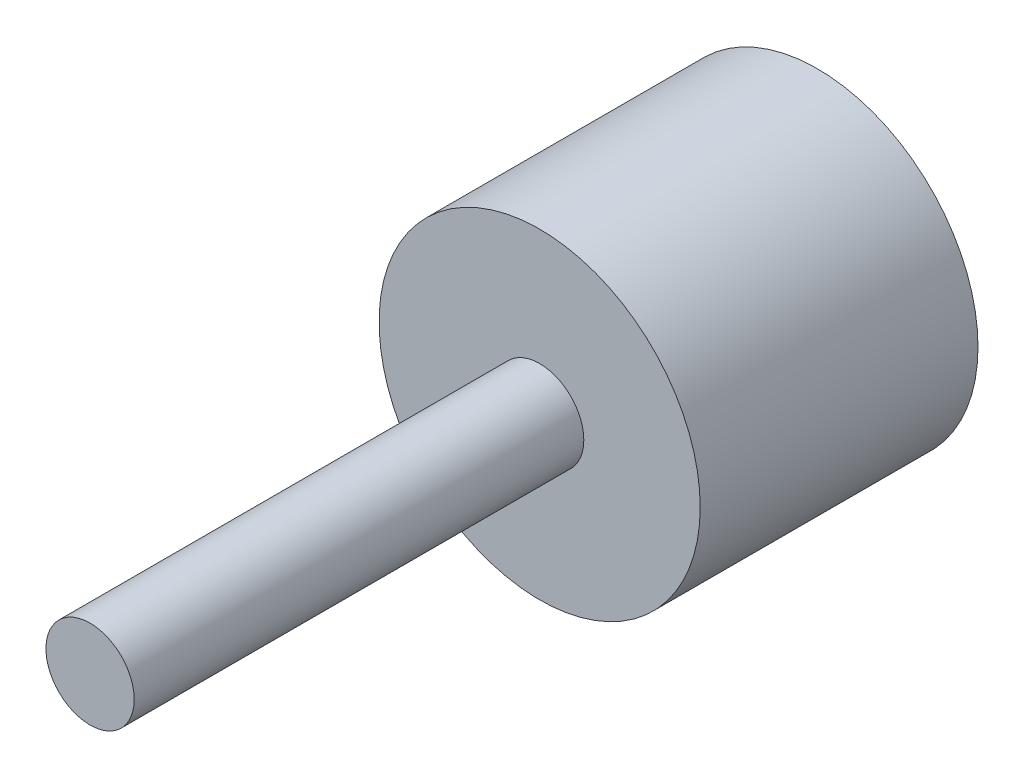
ISO-10303-21;
HEADER;
FILE_DESCRIPTION(('STEP AP214'),'2;1');
FILE_NAME('part.step','',(''),(''),'','','');
FILE_SCHEMA(('AUTOMOTIVE_DESIGN { 1 0 10303 214 1 1 1 1 }'));
ENDSEC;
DATA;
#1=APPLICATION_CONTEXT('core data for automotive mechanical design processes');
#2=APPLICATION_PROTOCOL_DEFINITION('international standard','automotive_design',2000,#1);
#3=PRODUCT_CONTEXT('',#1,'mechanical');
#4=PRODUCT('Part','Part','',(#3));
#5=PRODUCT_RELATED_PRODUCT_CATEGORY('part','',(#4));
#6=PRODUCT_DEFINITION_FORMATION('','',#4);
#7=PRODUCT_DEFINITION_CONTEXT('part definition',#1,'design');
#8=PRODUCT_DEFINITION('design','',#6,#7);
#9=PRODUCT_DEFINITION_SHAPE('','',#8);
#10=(LENGTH_UNIT() NAMED_UNIT(*) SI_UNIT(.MILLI.,.METRE.));
#11=(NAMED_UNIT(*) PLANE_ANGLE_UNIT() SI_UNIT($,.RADIAN.));
#12=(NAMED_UNIT(*) SI_UNIT($,.STERADIAN.) SOLID_ANGLE_UNIT());
#13=UNCERTAINTY_MEASURE_WITH_UNIT(LENGTH_MEASURE(1.E-05),#10,'distance_accuracy_value','');
#14=(GEOMETRIC_REPRESENTATION_CONTEXT(3) GLOBAL_UNCERTAINTY_ASSIGNED_CONTEXT((#13)) GLOBAL_UNIT_ASSIGNED_CONTEXT((#10,
#11,#12)) REPRESENTATION_CONTEXT('',''));
#15=CARTESIAN_POINT('',(0.,0.,0.));
#16=DIRECTION('',(0.,0.,1.));
#17=DIRECTION('',(1.,0.,0.));
#18=AXIS2_PLACEMENT_3D('',#15,#16,#17);
#19=CARTESIAN_POINT('',(0.,0.,0.));
#20=DIRECTION('',(0.,0.,1.));
#21=DIRECTION('',(1.,0.,0.));
#22=AXIS2_PLACEMENT_3D('',#19,#20,#21);
#23=PLANE('',#22);
#24=CARTESIAN_POINT('',(0.,0.,0.));
#25=DIRECTION('',(0.,0.,1.));
#26=DIRECTION('',(1.,0.,0.));
#27=AXIS2_PLACEMENT_3D('',#24,#25,#26);
#28=CIRCLE('',#27,10.);
#29=CARTESIAN_POINT('',(10.,0.,0.));
#30=VERTEX_POINT('',#29);
#31=EDGE_CURVE('E45',#30,#30,#28,.T.);
#32=ORIENTED_EDGE('',*,*,#31,.F.);
#33=EDGE_LOOP('',(#32));
#34=FACE_BOUND('',#33,.T.);
#35=CARTESIAN_POINT('',(0.,0.,0.));
#36=DIRECTION('',(0.,0.,1.));
#37=DIRECTION('',(1.,0.,0.));
#38=AXIS2_PLACEMENT_3D('',#35,#36,#37);
#39=CIRCLE('',#38,6.);
#40=CARTESIAN_POINT('',(6.,0.,0.));
#41=VERTEX_POINT('',#40);
#42=EDGE_CURVE('E37',#41,#41,#39,.F.);
#43=ORIENTED_EDGE('',*,*,#42,.F.);
#44=EDGE_LOOP('',(#43));
#45=FACE_BOUND('',#44,.T.);
#46=ADVANCED_FACE('F30',(#34,#45),#23,.F.);
#47=CARTESIAN_POINT('',(0.,0.,17.3));
#48=DIRECTION('',(0.,0.,1.));
#49=DIRECTION('',(1.,0.,0.));
#50=AXIS2_PLACEMENT_3D('',#47,#48,#49);
#51=PLANE('',#50);
#52=CARTESIAN_POINT('',(0.,0.,17.3));
#53=DIRECTION('',(0.,0.,1.));
#54=DIRECTION('',(1.,0.,0.));
#55=AXIS2_PLACEMENT_3D('',#52,#53,#54);
#56=CIRCLE('',#55,10.);
#57=CARTESIAN_POINT('',(10.,0.,17.3));
#58=VERTEX_POINT('',#57);
#59=EDGE_CURVE('E41',#58,#58,#56,.T.);
#60=ORIENTED_EDGE('',*,*,#59,.T.);
#61=EDGE_LOOP('',(#60));
#62=FACE_BOUND('',#61,.T.);
#63=CARTESIAN_POINT('',(0.,0.,17.3));
#64=DIRECTION('',(0.,0.,1.));
#65=DIRECTION('',(1.,0.,0.));
#66=AXIS2_PLACEMENT_3D('',#63,#64,#65);
#67=CIRCLE('',#66,2.75);
#68=CARTESIAN_POINT('',(2.75,0.,17.3));
#69=VERTEX_POINT('',#68);
#70=EDGE_CURVE('E51',#69,#69,#67,.T.);
#71=ORIENTED_EDGE('',*,*,#70,.F.);
#72=EDGE_LOOP('',(#71));
#73=FACE_BOUND('',#72,.T.);
#74=ADVANCED_FACE('F66',(#62,#73),#51,.T.);
#75=CARTESIAN_POINT('',(0.,0.,17.3));
#76=DIRECTION('',(0.,0.,-1.));
#77=DIRECTION('',(-1.,0.,0.));
#78=AXIS2_PLACEMENT_3D('',#75,#76,#77);
#79=CYLINDRICAL_SURFACE('',#78,10.);
#80=ORIENTED_EDGE('',*,*,#59,.F.);
#81=EDGE_LOOP('',(#80));
#82=FACE_BOUND('',#81,.T.);
#83=ORIENTED_EDGE('',*,*,#31,.T.);
#84=EDGE_LOOP('',(#83));
#85=FACE_BOUND('',#84,.T.);
#86=ADVANCED_FACE('F62',(#82,#85),#79,.T.);
#87=CARTESIAN_POINT('',(0.,0.,45.3));
#88=DIRECTION('',(0.,0.,-1.));
#89=DIRECTION('',(-1.,0.,0.));
#90=AXIS2_PLACEMENT_3D('',#87,#88,#89);
#91=CYLINDRICAL_SURFACE('',#90,2.75);
#92=CARTESIAN_POINT('',(0.,0.,45.3));
#93=DIRECTION('',(0.,0.,1.));
#94=DIRECTION('',(1.,0.,0.));
#95=AXIS2_PLACEMENT_3D('',#92,#93,#94);
#96=CIRCLE('',#95,2.75);
#97=CARTESIAN_POINT('',(2.75,0.,45.3));
#98=VERTEX_POINT('',#97);
#99=EDGE_CURVE('E49',#98,#98,#96,.T.);
#100=ORIENTED_EDGE('',*,*,#99,.F.);
#101=EDGE_LOOP('',(#100));
#102=FACE_BOUND('',#101,.T.);
#103=ORIENTED_EDGE('',*,*,#70,.T.);
#104=EDGE_LOOP('',(#103));
#105=FACE_BOUND('',#104,.T.);
#106=ADVANCED_FACE('F59',(#102,#105),#91,.T.);
#107=CARTESIAN_POINT('',(0.,0.,45.3));
#108=DIRECTION('',(0.,0.,1.));
#109=DIRECTION('',(1.,0.,0.));
#110=AXIS2_PLACEMENT_3D('',#107,#108,#109);
#111=PLANE('',#110);
#112=ORIENTED_EDGE('',*,*,#99,.T.);
#113=EDGE_LOOP('',(#112));
#114=FACE_BOUND('',#113,.T.);
#115=ADVANCED_FACE('F57',(#114),#111,.T.);
#116=CARTESIAN_POINT('',(0.,0.,-2.7));
#117=DIRECTION('',(0.,0.,-1.));
#118=DIRECTION('',(-1.,0.,0.));
#119=AXIS2_PLACEMENT_3D('',#116,#117,#118);
#120=PLANE('',#119);
#121=CARTESIAN_POINT('',(0.,0.,-2.7));
#122=DIRECTION('',(0.,0.,-1.));
#123=DIRECTION('',(-1.,0.,0.));
#124=AXIS2_PLACEMENT_3D('',#121,#122,#123);
#125=CIRCLE('',#124,0.98901207345298);
#126=CARTESIAN_POINT('',(-0.98901207345298,0.,-2.7));
#127=VERTEX_POINT('',#126);
#128=EDGE_CURVE('E10',#127,#127,#125,.T.);
#129=ORIENTED_EDGE('',*,*,#128,.T.);
#130=EDGE_LOOP('',(#129));
#131=FACE_BOUND('',#130,.T.);
#132=ADVANCED_FACE('F80',(#131),#120,.T.);
#133=CARTESIAN_POINT('',(0.,0.,3.3));
#134=DIRECTION('',(0.,0.,1.));
#135=DIRECTION('',(1.,0.,0.));
#136=AXIS2_PLACEMENT_3D('',#133,#134,#135);
#137=DEGENERATE_TOROIDAL_SURFACE('',#136,0.98901207345298,6.,.T.);
#138=ORIENTED_EDGE('',*,*,#42,.T.);
#139=EDGE_LOOP('',(#138));
#140=FACE_BOUND('',#139,.T.);
#141=ORIENTED_EDGE('',*,*,#128,.F.);
#142=EDGE_LOOP('',(#141));
#143=FACE_BOUND('',#142,.T.);
#144=ADVANCED_FACE('F32',(#140,#143),#137,.T.);
#145=CLOSED_SHELL('',(#46,#74,#86,#106,#115,#132,#144));
#146=MANIFOLD_SOLID_BREP('B2',#145);
#147=ADVANCED_BREP_SHAPE_REPRESENTATION('',(#18,#146),#14);
#148=SHAPE_DEFINITION_REPRESENTATION(#9,#147);
ENDSEC;
END-ISO-10303-21;
